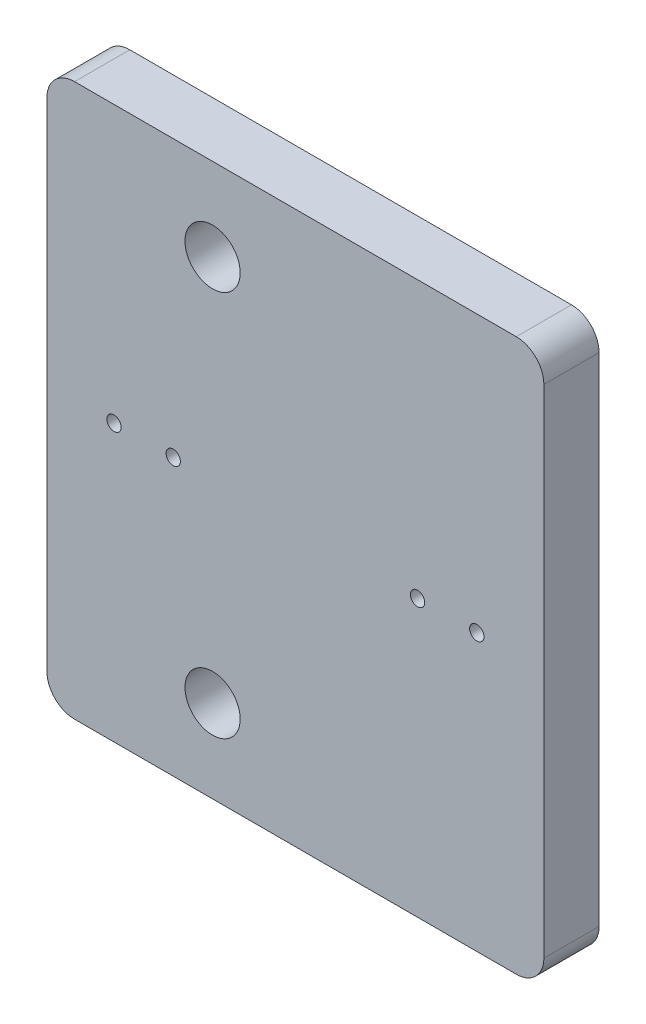
ISO-10303-21;
HEADER;
FILE_DESCRIPTION(('STEP AP214'),'2;1');
FILE_NAME('part.step','',(''),(''),'','','');
FILE_SCHEMA(('AUTOMOTIVE_DESIGN { 1 0 10303 214 1 1 1 1 }'));
ENDSEC;
DATA;
#1=APPLICATION_CONTEXT('core data for automotive mechanical design processes');
#2=APPLICATION_PROTOCOL_DEFINITION('international standard','automotive_design',2000,#1);
#3=PRODUCT_CONTEXT('',#1,'mechanical');
#4=PRODUCT('Part','Part','',(#3));
#5=PRODUCT_RELATED_PRODUCT_CATEGORY('part','',(#4));
#6=PRODUCT_DEFINITION_FORMATION('','',#4);
#7=PRODUCT_DEFINITION_CONTEXT('part definition',#1,'design');
#8=PRODUCT_DEFINITION('design','',#6,#7);
#9=PRODUCT_DEFINITION_SHAPE('','',#8);
#10=(LENGTH_UNIT() NAMED_UNIT(*) SI_UNIT(.MILLI.,.METRE.));
#11=(NAMED_UNIT(*) PLANE_ANGLE_UNIT() SI_UNIT($,.RADIAN.));
#12=(NAMED_UNIT(*) SI_UNIT($,.STERADIAN.) SOLID_ANGLE_UNIT());
#13=UNCERTAINTY_MEASURE_WITH_UNIT(LENGTH_MEASURE(1.E-05),#10,'distance_accuracy_value','');
#14=(GEOMETRIC_REPRESENTATION_CONTEXT(3) GLOBAL_UNCERTAINTY_ASSIGNED_CONTEXT((#13)) GLOBAL_UNIT_ASSIGNED_CONTEXT((#10,
#11,#12)) REPRESENTATION_CONTEXT('',''));
#15=CARTESIAN_POINT('',(0.,0.,0.));
#16=DIRECTION('',(0.,0.,1.));
#17=DIRECTION('',(1.,0.,0.));
#18=AXIS2_PLACEMENT_3D('',#15,#16,#17);
#19=CARTESIAN_POINT('',(0.,0.,12.7));
#20=DIRECTION('',(0.,0.,-1.));
#21=DIRECTION('',(-1.,0.,0.));
#22=AXIS2_PLACEMENT_3D('',#19,#20,#21);
#23=PLANE('',#22);
#24=DIRECTION('',(-1.,0.,0.));
#25=VECTOR('',#24,1.);
#26=CARTESIAN_POINT('',(-57.15,63.5,12.7));
#27=LINE('',#26,#25);
#28=CARTESIAN_POINT('',(50.8,63.5,12.7));
#29=VERTEX_POINT('',#28);
#30=CARTESIAN_POINT('',(-50.8,63.5,12.7));
#31=VERTEX_POINT('',#30);
#32=EDGE_CURVE('E167',#29,#31,#27,.T.);
#33=ORIENTED_EDGE('',*,*,#32,.T.);
#34=CARTESIAN_POINT('',(-50.8,57.15,12.7));
#35=DIRECTION('',(0.,0.,-1.));
#36=DIRECTION('',(-1.,0.,0.));
#37=AXIS2_PLACEMENT_3D('',#34,#35,#36);
#38=CIRCLE('',#37,6.35);
#39=CARTESIAN_POINT('',(-57.15,57.15,12.7));
#40=VERTEX_POINT('',#39);
#41=EDGE_CURVE('E148',#31,#40,#38,.F.);
#42=ORIENTED_EDGE('',*,*,#41,.T.);
#43=DIRECTION('',(0.,-1.,0.));
#44=VECTOR('',#43,1.);
#45=CARTESIAN_POINT('',(-57.15,-63.5,12.7));
#46=LINE('',#45,#44);
#47=CARTESIAN_POINT('',(-57.15,-57.15,12.7));
#48=VERTEX_POINT('',#47);
#49=EDGE_CURVE('E118',#40,#48,#46,.T.);
#50=ORIENTED_EDGE('',*,*,#49,.T.);
#51=CARTESIAN_POINT('',(-50.8,-57.15,12.7));
#52=DIRECTION('',(0.,0.,-1.));
#53=DIRECTION('',(-1.,0.,0.));
#54=AXIS2_PLACEMENT_3D('',#51,#52,#53);
#55=CIRCLE('',#54,6.35);
#56=CARTESIAN_POINT('',(-50.8,-63.5,12.7));
#57=VERTEX_POINT('',#56);
#58=EDGE_CURVE('E54',#48,#57,#55,.F.);
#59=ORIENTED_EDGE('',*,*,#58,.T.);
#60=DIRECTION('',(1.,0.,0.));
#61=VECTOR('',#60,1.);
#62=CARTESIAN_POINT('',(-57.15,-63.5,12.7));
#63=LINE('',#62,#61);
#64=CARTESIAN_POINT('',(50.8,-63.5,12.7));
#65=VERTEX_POINT('',#64);
#66=EDGE_CURVE('E134',#57,#65,#63,.T.);
#67=ORIENTED_EDGE('',*,*,#66,.T.);
#68=CARTESIAN_POINT('',(50.8,-57.15,12.7));
#69=DIRECTION('',(0.,0.,-1.));
#70=DIRECTION('',(-1.,0.,0.));
#71=AXIS2_PLACEMENT_3D('',#68,#69,#70);
#72=CIRCLE('',#71,6.35);
#73=CARTESIAN_POINT('',(57.15,-57.15,12.7));
#74=VERTEX_POINT('',#73);
#75=EDGE_CURVE('E145',#65,#74,#72,.F.);
#76=ORIENTED_EDGE('',*,*,#75,.T.);
#77=DIRECTION('',(0.,1.,0.));
#78=VECTOR('',#77,1.);
#79=CARTESIAN_POINT('',(57.15,-63.5,12.7));
#80=LINE('',#79,#78);
#81=CARTESIAN_POINT('',(57.15,57.15,12.7));
#82=VERTEX_POINT('',#81);
#83=EDGE_CURVE('E128',#74,#82,#80,.T.);
#84=ORIENTED_EDGE('',*,*,#83,.T.);
#85=CARTESIAN_POINT('',(50.8,57.15,12.7));
#86=DIRECTION('',(0.,0.,-1.));
#87=DIRECTION('',(-1.,0.,0.));
#88=AXIS2_PLACEMENT_3D('',#85,#86,#87);
#89=CIRCLE('',#88,6.35);
#90=EDGE_CURVE('E143',#82,#29,#89,.F.);
#91=ORIENTED_EDGE('',*,*,#90,.T.);
#92=EDGE_LOOP('',(#33,#42,#50,#59,#67,#76,#84,#91));
#93=FACE_BOUND('',#92,.T.);
#94=CARTESIAN_POINT('',(-41.72966,0.,12.7));
#95=DIRECTION('',(0.,0.,1.));
#96=DIRECTION('',(1.,0.,0.));
#97=AXIS2_PLACEMENT_3D('',#94,#95,#96);
#98=CIRCLE('',#97,1.651);
#99=CARTESIAN_POINT('',(-40.07866,0.,12.7));
#100=VERTEX_POINT('',#99);
#101=EDGE_CURVE('E172',#100,#100,#98,.T.);
#102=ORIENTED_EDGE('',*,*,#101,.F.);
#103=EDGE_LOOP('',(#102));
#104=FACE_BOUND('',#103,.T.);
#105=CARTESIAN_POINT('',(-28.09748,0.,12.7));
#106=DIRECTION('',(0.,0.,1.));
#107=DIRECTION('',(1.,0.,0.));
#108=AXIS2_PLACEMENT_3D('',#105,#106,#107);
#109=CIRCLE('',#108,1.651);
#110=CARTESIAN_POINT('',(-26.44648,0.,12.7));
#111=VERTEX_POINT('',#110);
#112=EDGE_CURVE('E181',#111,#111,#109,.T.);
#113=ORIENTED_EDGE('',*,*,#112,.F.);
#114=EDGE_LOOP('',(#113));
#115=FACE_BOUND('',#114,.T.);
#116=CARTESIAN_POINT('',(28.09748,0.,12.7));
#117=DIRECTION('',(0.,0.,1.));
#118=DIRECTION('',(1.,0.,0.));
#119=AXIS2_PLACEMENT_3D('',#116,#117,#118);
#120=CIRCLE('',#119,1.651);
#121=CARTESIAN_POINT('',(29.74848,0.,12.7));
#122=VERTEX_POINT('',#121);
#123=EDGE_CURVE('E186',#122,#122,#120,.T.);
#124=ORIENTED_EDGE('',*,*,#123,.F.);
#125=EDGE_LOOP('',(#124));
#126=FACE_BOUND('',#125,.T.);
#127=CARTESIAN_POINT('',(41.72966,0.,12.7));
#128=DIRECTION('',(0.,0.,1.));
#129=DIRECTION('',(1.,0.,0.));
#130=AXIS2_PLACEMENT_3D('',#127,#128,#129);
#131=CIRCLE('',#130,1.651);
#132=CARTESIAN_POINT('',(43.38066,0.,12.7));
#133=VERTEX_POINT('',#132);
#134=EDGE_CURVE('E192',#133,#133,#131,.T.);
#135=ORIENTED_EDGE('',*,*,#134,.F.);
#136=EDGE_LOOP('',(#135));
#137=FACE_BOUND('',#136,.T.);
#138=CARTESIAN_POINT('',(-19.05,44.45,12.7));
#139=DIRECTION('',(0.,0.,1.));
#140=DIRECTION('',(1.,0.,0.));
#141=AXIS2_PLACEMENT_3D('',#138,#139,#140);
#142=CIRCLE('',#141,6.35);
#143=CARTESIAN_POINT('',(-12.7,44.45,12.7));
#144=VERTEX_POINT('',#143);
#145=EDGE_CURVE('E198',#144,#144,#142,.T.);
#146=ORIENTED_EDGE('',*,*,#145,.F.);
#147=EDGE_LOOP('',(#146));
#148=FACE_BOUND('',#147,.T.);
#149=CARTESIAN_POINT('',(-19.05,-44.45,12.7));
#150=DIRECTION('',(0.,0.,1.));
#151=DIRECTION('',(1.,0.,0.));
#152=AXIS2_PLACEMENT_3D('',#149,#150,#151);
#153=CIRCLE('',#152,6.35);
#154=CARTESIAN_POINT('',(-12.7,-44.45,12.7));
#155=VERTEX_POINT('',#154);
#156=EDGE_CURVE('E204',#155,#155,#153,.T.);
#157=ORIENTED_EDGE('',*,*,#156,.F.);
#158=EDGE_LOOP('',(#157));
#159=FACE_BOUND('',#158,.T.);
#160=ADVANCED_FACE('F32',(#93,#104,#115,#126,#137,#148,#159),#23,.F.);
#161=CARTESIAN_POINT('',(0.,0.,0.));
#162=DIRECTION('',(0.,0.,-1.));
#163=DIRECTION('',(-1.,0.,0.));
#164=AXIS2_PLACEMENT_3D('',#161,#162,#163);
#165=PLANE('',#164);
#166=CARTESIAN_POINT('',(-19.05,44.45,0.));
#167=DIRECTION('',(0.,0.,1.));
#168=DIRECTION('',(1.,0.,0.));
#169=AXIS2_PLACEMENT_3D('',#166,#167,#168);
#170=CIRCLE('',#169,6.35);
#171=CARTESIAN_POINT('',(-12.7,44.45,0.));
#172=VERTEX_POINT('',#171);
#173=EDGE_CURVE('E201',#172,#172,#170,.T.);
#174=ORIENTED_EDGE('',*,*,#173,.T.);
#175=EDGE_LOOP('',(#174));
#176=FACE_BOUND('',#175,.T.);
#177=CARTESIAN_POINT('',(28.09748,0.,0.));
#178=DIRECTION('',(0.,0.,1.));
#179=DIRECTION('',(1.,0.,0.));
#180=AXIS2_PLACEMENT_3D('',#177,#178,#179);
#181=CIRCLE('',#180,1.651);
#182=CARTESIAN_POINT('',(29.74848,0.,0.));
#183=VERTEX_POINT('',#182);
#184=EDGE_CURVE('E189',#183,#183,#181,.T.);
#185=ORIENTED_EDGE('',*,*,#184,.T.);
#186=EDGE_LOOP('',(#185));
#187=FACE_BOUND('',#186,.T.);
#188=CARTESIAN_POINT('',(-41.72966,0.,0.));
#189=DIRECTION('',(0.,0.,1.));
#190=DIRECTION('',(1.,0.,0.));
#191=AXIS2_PLACEMENT_3D('',#188,#189,#190);
#192=CIRCLE('',#191,1.651);
#193=CARTESIAN_POINT('',(-40.07866,0.,0.));
#194=VERTEX_POINT('',#193);
#195=EDGE_CURVE('E174',#194,#194,#192,.T.);
#196=ORIENTED_EDGE('',*,*,#195,.T.);
#197=EDGE_LOOP('',(#196));
#198=FACE_BOUND('',#197,.T.);
#199=DIRECTION('',(0.,-1.,0.));
#200=VECTOR('',#199,1.);
#201=CARTESIAN_POINT('',(-57.15,-63.5,0.));
#202=LINE('',#201,#200);
#203=CARTESIAN_POINT('',(-57.15,57.15,0.));
#204=VERTEX_POINT('',#203);
#205=CARTESIAN_POINT('',(-57.15,-57.15,0.));
#206=VERTEX_POINT('',#205);
#207=EDGE_CURVE('E116',#204,#206,#202,.T.);
#208=ORIENTED_EDGE('',*,*,#207,.F.);
#209=CARTESIAN_POINT('',(-50.8,57.15,0.));
#210=DIRECTION('',(0.,0.,-1.));
#211=DIRECTION('',(-1.,0.,0.));
#212=AXIS2_PLACEMENT_3D('',#209,#210,#211);
#213=CIRCLE('',#212,6.35);
#214=CARTESIAN_POINT('',(-50.8,63.5,0.));
#215=VERTEX_POINT('',#214);
#216=EDGE_CURVE('E99',#204,#215,#213,.T.);
#217=ORIENTED_EDGE('',*,*,#216,.T.);
#218=DIRECTION('',(-1.,0.,0.));
#219=VECTOR('',#218,1.);
#220=CARTESIAN_POINT('',(-57.15,63.5,0.));
#221=LINE('',#220,#219);
#222=CARTESIAN_POINT('',(50.8,63.5,0.));
#223=VERTEX_POINT('',#222);
#224=EDGE_CURVE('E126',#223,#215,#221,.T.);
#225=ORIENTED_EDGE('',*,*,#224,.F.);
#226=CARTESIAN_POINT('',(50.8,57.15,0.));
#227=DIRECTION('',(0.,0.,-1.));
#228=DIRECTION('',(-1.,0.,0.));
#229=AXIS2_PLACEMENT_3D('',#226,#227,#228);
#230=CIRCLE('',#229,6.35);
#231=CARTESIAN_POINT('',(57.15,57.15,0.));
#232=VERTEX_POINT('',#231);
#233=EDGE_CURVE('E119',#223,#232,#230,.T.);
#234=ORIENTED_EDGE('',*,*,#233,.T.);
#235=DIRECTION('',(0.,1.,0.));
#236=VECTOR('',#235,1.);
#237=CARTESIAN_POINT('',(57.15,-63.5,0.));
#238=LINE('',#237,#236);
#239=CARTESIAN_POINT('',(57.15,-57.15,0.));
#240=VERTEX_POINT('',#239);
#241=EDGE_CURVE('E130',#240,#232,#238,.T.);
#242=ORIENTED_EDGE('',*,*,#241,.F.);
#243=CARTESIAN_POINT('',(50.8,-57.15,0.));
#244=DIRECTION('',(0.,0.,-1.));
#245=DIRECTION('',(-1.,0.,0.));
#246=AXIS2_PLACEMENT_3D('',#243,#244,#245);
#247=CIRCLE('',#246,6.35);
#248=CARTESIAN_POINT('',(50.8,-63.5,0.));
#249=VERTEX_POINT('',#248);
#250=EDGE_CURVE('E137',#240,#249,#247,.T.);
#251=ORIENTED_EDGE('',*,*,#250,.T.);
#252=DIRECTION('',(1.,0.,0.));
#253=VECTOR('',#252,1.);
#254=CARTESIAN_POINT('',(-57.15,-63.5,0.));
#255=LINE('',#254,#253);
#256=CARTESIAN_POINT('',(-50.8,-63.5,0.));
#257=VERTEX_POINT('',#256);
#258=EDGE_CURVE('E125',#257,#249,#255,.T.);
#259=ORIENTED_EDGE('',*,*,#258,.F.);
#260=CARTESIAN_POINT('',(-50.8,-57.15,0.));
#261=DIRECTION('',(0.,0.,-1.));
#262=DIRECTION('',(-1.,0.,0.));
#263=AXIS2_PLACEMENT_3D('',#260,#261,#262);
#264=CIRCLE('',#263,6.35);
#265=EDGE_CURVE('E110',#257,#206,#264,.T.);
#266=ORIENTED_EDGE('',*,*,#265,.T.);
#267=EDGE_LOOP('',(#208,#217,#225,#234,#242,#251,#259,#266));
#268=FACE_BOUND('',#267,.T.);
#269=CARTESIAN_POINT('',(-28.09748,0.,0.));
#270=DIRECTION('',(0.,0.,1.));
#271=DIRECTION('',(1.,0.,0.));
#272=AXIS2_PLACEMENT_3D('',#269,#270,#271);
#273=CIRCLE('',#272,1.651);
#274=CARTESIAN_POINT('',(-26.44648,0.,0.));
#275=VERTEX_POINT('',#274);
#276=EDGE_CURVE('E183',#275,#275,#273,.T.);
#277=ORIENTED_EDGE('',*,*,#276,.T.);
#278=EDGE_LOOP('',(#277));
#279=FACE_BOUND('',#278,.T.);
#280=CARTESIAN_POINT('',(41.72966,0.,0.));
#281=DIRECTION('',(0.,0.,1.));
#282=DIRECTION('',(1.,0.,0.));
#283=AXIS2_PLACEMENT_3D('',#280,#281,#282);
#284=CIRCLE('',#283,1.651);
#285=CARTESIAN_POINT('',(43.38066,0.,0.));
#286=VERTEX_POINT('',#285);
#287=EDGE_CURVE('E195',#286,#286,#284,.T.);
#288=ORIENTED_EDGE('',*,*,#287,.T.);
#289=EDGE_LOOP('',(#288));
#290=FACE_BOUND('',#289,.T.);
#291=CARTESIAN_POINT('',(-19.05,-44.45,0.));
#292=DIRECTION('',(0.,0.,1.));
#293=DIRECTION('',(1.,0.,0.));
#294=AXIS2_PLACEMENT_3D('',#291,#292,#293);
#295=CIRCLE('',#294,6.35);
#296=CARTESIAN_POINT('',(-12.7,-44.45,0.));
#297=VERTEX_POINT('',#296);
#298=EDGE_CURVE('E207',#297,#297,#295,.T.);
#299=ORIENTED_EDGE('',*,*,#298,.T.);
#300=EDGE_LOOP('',(#299));
#301=FACE_BOUND('',#300,.T.);
#302=ADVANCED_FACE('F122',(#176,#187,#198,#268,#279,#290,#301),#165,.T.);
#303=CARTESIAN_POINT('',(57.15,-63.5,12.7));
#304=DIRECTION('',(-1.,0.,0.));
#305=DIRECTION('',(0.,0.,1.));
#306=AXIS2_PLACEMENT_3D('',#303,#304,#305);
#307=PLANE('',#306);
#308=ORIENTED_EDGE('',*,*,#83,.F.);
#309=DIRECTION('',(0.,0.,-1.));
#310=VECTOR('',#309,1.);
#311=CARTESIAN_POINT('',(57.15,-57.15,12.7));
#312=LINE('',#311,#310);
#313=EDGE_CURVE('E11',#74,#240,#312,.T.);
#314=ORIENTED_EDGE('',*,*,#313,.T.);
#315=ORIENTED_EDGE('',*,*,#241,.T.);
#316=DIRECTION('',(0.,0.,-1.));
#317=VECTOR('',#316,1.);
#318=CARTESIAN_POINT('',(57.15,57.15,12.7));
#319=LINE('',#318,#317);
#320=EDGE_CURVE('E40',#232,#82,#319,.F.);
#321=ORIENTED_EDGE('',*,*,#320,.T.);
#322=EDGE_LOOP('',(#308,#314,#315,#321));
#323=FACE_BOUND('',#322,.T.);
#324=ADVANCED_FACE('F158',(#323),#307,.F.);
#325=CARTESIAN_POINT('',(-57.15,63.5,12.7));
#326=DIRECTION('',(0.,-1.,0.));
#327=DIRECTION('',(0.,0.,-1.));
#328=AXIS2_PLACEMENT_3D('',#325,#326,#327);
#329=PLANE('',#328);
#330=ORIENTED_EDGE('',*,*,#224,.T.);
#331=DIRECTION('',(0.,0.,-1.));
#332=VECTOR('',#331,1.);
#333=CARTESIAN_POINT('',(-50.8,63.5,12.7));
#334=LINE('',#333,#332);
#335=EDGE_CURVE('E104',#215,#31,#334,.F.);
#336=ORIENTED_EDGE('',*,*,#335,.T.);
#337=ORIENTED_EDGE('',*,*,#32,.F.);
#338=DIRECTION('',(0.,0.,-1.));
#339=VECTOR('',#338,1.);
#340=CARTESIAN_POINT('',(50.8,63.5,12.7));
#341=LINE('',#340,#339);
#342=EDGE_CURVE('E109',#29,#223,#341,.T.);
#343=ORIENTED_EDGE('',*,*,#342,.T.);
#344=EDGE_LOOP('',(#330,#336,#337,#343));
#345=FACE_BOUND('',#344,.T.);
#346=ADVANCED_FACE('F171',(#345),#329,.F.);
#347=CARTESIAN_POINT('',(-57.15,-63.5,12.7));
#348=DIRECTION('',(1.,0.,0.));
#349=DIRECTION('',(0.,0.,-1.));
#350=AXIS2_PLACEMENT_3D('',#347,#348,#349);
#351=PLANE('',#350);
#352=ORIENTED_EDGE('',*,*,#49,.F.);
#353=DIRECTION('',(0.,0.,-1.));
#354=VECTOR('',#353,1.);
#355=CARTESIAN_POINT('',(-57.15,57.15,12.7));
#356=LINE('',#355,#354);
#357=EDGE_CURVE('E103',#40,#204,#356,.T.);
#358=ORIENTED_EDGE('',*,*,#357,.T.);
#359=ORIENTED_EDGE('',*,*,#207,.T.);
#360=DIRECTION('',(0.,0.,-1.));
#361=VECTOR('',#360,1.);
#362=CARTESIAN_POINT('',(-57.15,-57.15,12.7));
#363=LINE('',#362,#361);
#364=EDGE_CURVE('E120',#206,#48,#363,.F.);
#365=ORIENTED_EDGE('',*,*,#364,.T.);
#366=EDGE_LOOP('',(#352,#358,#359,#365));
#367=FACE_BOUND('',#366,.T.);
#368=ADVANCED_FACE('F115',(#367),#351,.F.);
#369=CARTESIAN_POINT('',(-57.15,-63.5,12.7));
#370=DIRECTION('',(0.,1.,0.));
#371=DIRECTION('',(0.,0.,1.));
#372=AXIS2_PLACEMENT_3D('',#369,#370,#371);
#373=PLANE('',#372);
#374=ORIENTED_EDGE('',*,*,#66,.F.);
#375=DIRECTION('',(0.,0.,-1.));
#376=VECTOR('',#375,1.);
#377=CARTESIAN_POINT('',(-50.8,-63.5,12.7));
#378=LINE('',#377,#376);
#379=EDGE_CURVE('E151',#57,#257,#378,.T.);
#380=ORIENTED_EDGE('',*,*,#379,.T.);
#381=ORIENTED_EDGE('',*,*,#258,.T.);
#382=DIRECTION('',(0.,0.,-1.));
#383=VECTOR('',#382,1.);
#384=CARTESIAN_POINT('',(50.8,-63.5,12.7));
#385=LINE('',#384,#383);
#386=EDGE_CURVE('E47',#249,#65,#385,.F.);
#387=ORIENTED_EDGE('',*,*,#386,.T.);
#388=EDGE_LOOP('',(#374,#380,#381,#387));
#389=FACE_BOUND('',#388,.T.);
#390=ADVANCED_FACE('F227',(#389),#373,.F.);
#391=CARTESIAN_POINT('',(-41.72966,0.,12.7));
#392=DIRECTION('',(0.,0.,-1.));
#393=DIRECTION('',(-1.,0.,0.));
#394=AXIS2_PLACEMENT_3D('',#391,#392,#393);
#395=CYLINDRICAL_SURFACE('',#394,1.651);
#396=ORIENTED_EDGE('',*,*,#101,.T.);
#397=EDGE_LOOP('',(#396));
#398=FACE_BOUND('',#397,.T.);
#399=ORIENTED_EDGE('',*,*,#195,.F.);
#400=EDGE_LOOP('',(#399));
#401=FACE_BOUND('',#400,.T.);
#402=ADVANCED_FACE('F224',(#398,#401),#395,.F.);
#403=CARTESIAN_POINT('',(-28.09748,0.,12.7));
#404=DIRECTION('',(0.,0.,-1.));
#405=DIRECTION('',(-1.,0.,0.));
#406=AXIS2_PLACEMENT_3D('',#403,#404,#405);
#407=CYLINDRICAL_SURFACE('',#406,1.651);
#408=ORIENTED_EDGE('',*,*,#112,.T.);
#409=EDGE_LOOP('',(#408));
#410=FACE_BOUND('',#409,.T.);
#411=ORIENTED_EDGE('',*,*,#276,.F.);
#412=EDGE_LOOP('',(#411));
#413=FACE_BOUND('',#412,.T.);
#414=ADVANCED_FACE('F339',(#410,#413),#407,.F.);
#415=CARTESIAN_POINT('',(28.09748,0.,12.7));
#416=DIRECTION('',(0.,0.,-1.));
#417=DIRECTION('',(-1.,0.,0.));
#418=AXIS2_PLACEMENT_3D('',#415,#416,#417);
#419=CYLINDRICAL_SURFACE('',#418,1.651);
#420=ORIENTED_EDGE('',*,*,#123,.T.);
#421=EDGE_LOOP('',(#420));
#422=FACE_BOUND('',#421,.T.);
#423=ORIENTED_EDGE('',*,*,#184,.F.);
#424=EDGE_LOOP('',(#423));
#425=FACE_BOUND('',#424,.T.);
#426=ADVANCED_FACE('F329',(#422,#425),#419,.F.);
#427=CARTESIAN_POINT('',(41.72966,0.,12.7));
#428=DIRECTION('',(0.,0.,-1.));
#429=DIRECTION('',(-1.,0.,0.));
#430=AXIS2_PLACEMENT_3D('',#427,#428,#429);
#431=CYLINDRICAL_SURFACE('',#430,1.651);
#432=ORIENTED_EDGE('',*,*,#134,.T.);
#433=EDGE_LOOP('',(#432));
#434=FACE_BOUND('',#433,.T.);
#435=ORIENTED_EDGE('',*,*,#287,.F.);
#436=EDGE_LOOP('',(#435));
#437=FACE_BOUND('',#436,.T.);
#438=ADVANCED_FACE('F319',(#434,#437),#431,.F.);
#439=CARTESIAN_POINT('',(-19.05,44.45,12.7));
#440=DIRECTION('',(0.,0.,-1.));
#441=DIRECTION('',(-1.,0.,0.));
#442=AXIS2_PLACEMENT_3D('',#439,#440,#441);
#443=CYLINDRICAL_SURFACE('',#442,6.35);
#444=ORIENTED_EDGE('',*,*,#145,.T.);
#445=EDGE_LOOP('',(#444));
#446=FACE_BOUND('',#445,.T.);
#447=ORIENTED_EDGE('',*,*,#173,.F.);
#448=EDGE_LOOP('',(#447));
#449=FACE_BOUND('',#448,.T.);
#450=ADVANCED_FACE('F310',(#446,#449),#443,.F.);
#451=CARTESIAN_POINT('',(-19.05,-44.45,12.7));
#452=DIRECTION('',(0.,0.,-1.));
#453=DIRECTION('',(-1.,0.,0.));
#454=AXIS2_PLACEMENT_3D('',#451,#452,#453);
#455=CYLINDRICAL_SURFACE('',#454,6.35);
#456=ORIENTED_EDGE('',*,*,#156,.T.);
#457=EDGE_LOOP('',(#456));
#458=FACE_BOUND('',#457,.T.);
#459=ORIENTED_EDGE('',*,*,#298,.F.);
#460=EDGE_LOOP('',(#459));
#461=FACE_BOUND('',#460,.T.);
#462=ADVANCED_FACE('F213',(#458,#461),#455,.F.);
#463=CARTESIAN_POINT('',(-50.8,57.15,12.7));
#464=DIRECTION('',(0.,0.,-1.));
#465=DIRECTION('',(-1.,0.,0.));
#466=AXIS2_PLACEMENT_3D('',#463,#464,#465);
#467=CYLINDRICAL_SURFACE('',#466,6.35);
#468=ORIENTED_EDGE('',*,*,#41,.F.);
#469=ORIENTED_EDGE('',*,*,#335,.F.);
#470=ORIENTED_EDGE('',*,*,#216,.F.);
#471=ORIENTED_EDGE('',*,*,#357,.F.);
#472=EDGE_LOOP('',(#468,#469,#470,#471));
#473=FACE_BOUND('',#472,.T.);
#474=ADVANCED_FACE('F102',(#473),#467,.T.);
#475=CARTESIAN_POINT('',(-50.8,-57.15,12.7));
#476=DIRECTION('',(0.,0.,-1.));
#477=DIRECTION('',(-1.,0.,0.));
#478=AXIS2_PLACEMENT_3D('',#475,#476,#477);
#479=CYLINDRICAL_SURFACE('',#478,6.35);
#480=ORIENTED_EDGE('',*,*,#58,.F.);
#481=ORIENTED_EDGE('',*,*,#364,.F.);
#482=ORIENTED_EDGE('',*,*,#265,.F.);
#483=ORIENTED_EDGE('',*,*,#379,.F.);
#484=EDGE_LOOP('',(#480,#481,#482,#483));
#485=FACE_BOUND('',#484,.T.);
#486=ADVANCED_FACE('F238',(#485),#479,.T.);
#487=CARTESIAN_POINT('',(50.8,-57.15,12.7));
#488=DIRECTION('',(0.,0.,-1.));
#489=DIRECTION('',(-1.,0.,0.));
#490=AXIS2_PLACEMENT_3D('',#487,#488,#489);
#491=CYLINDRICAL_SURFACE('',#490,6.35);
#492=ORIENTED_EDGE('',*,*,#75,.F.);
#493=ORIENTED_EDGE('',*,*,#386,.F.);
#494=ORIENTED_EDGE('',*,*,#250,.F.);
#495=ORIENTED_EDGE('',*,*,#313,.F.);
#496=EDGE_LOOP('',(#492,#493,#494,#495));
#497=FACE_BOUND('',#496,.T.);
#498=ADVANCED_FACE('F240',(#497),#491,.T.);
#499=CARTESIAN_POINT('',(50.8,57.15,12.7));
#500=DIRECTION('',(0.,0.,-1.));
#501=DIRECTION('',(-1.,0.,0.));
#502=AXIS2_PLACEMENT_3D('',#499,#500,#501);
#503=CYLINDRICAL_SURFACE('',#502,6.35);
#504=ORIENTED_EDGE('',*,*,#90,.F.);
#505=ORIENTED_EDGE('',*,*,#320,.F.);
#506=ORIENTED_EDGE('',*,*,#233,.F.);
#507=ORIENTED_EDGE('',*,*,#342,.F.);
#508=EDGE_LOOP('',(#504,#505,#506,#507));
#509=FACE_BOUND('',#508,.T.);
#510=ADVANCED_FACE('F34',(#509),#503,.T.);
#511=CLOSED_SHELL('',(#160,#302,#324,#346,#368,#390,#402,#414,#426,#438,#450,#462,#474,#486,
#498,#510));
#512=MANIFOLD_SOLID_BREP('B2',#511);
#513=ADVANCED_BREP_SHAPE_REPRESENTATION('',(#18,#512),#14);
#514=SHAPE_DEFINITION_REPRESENTATION(#9,#513);
ENDSEC;
END-ISO-10303-21;
